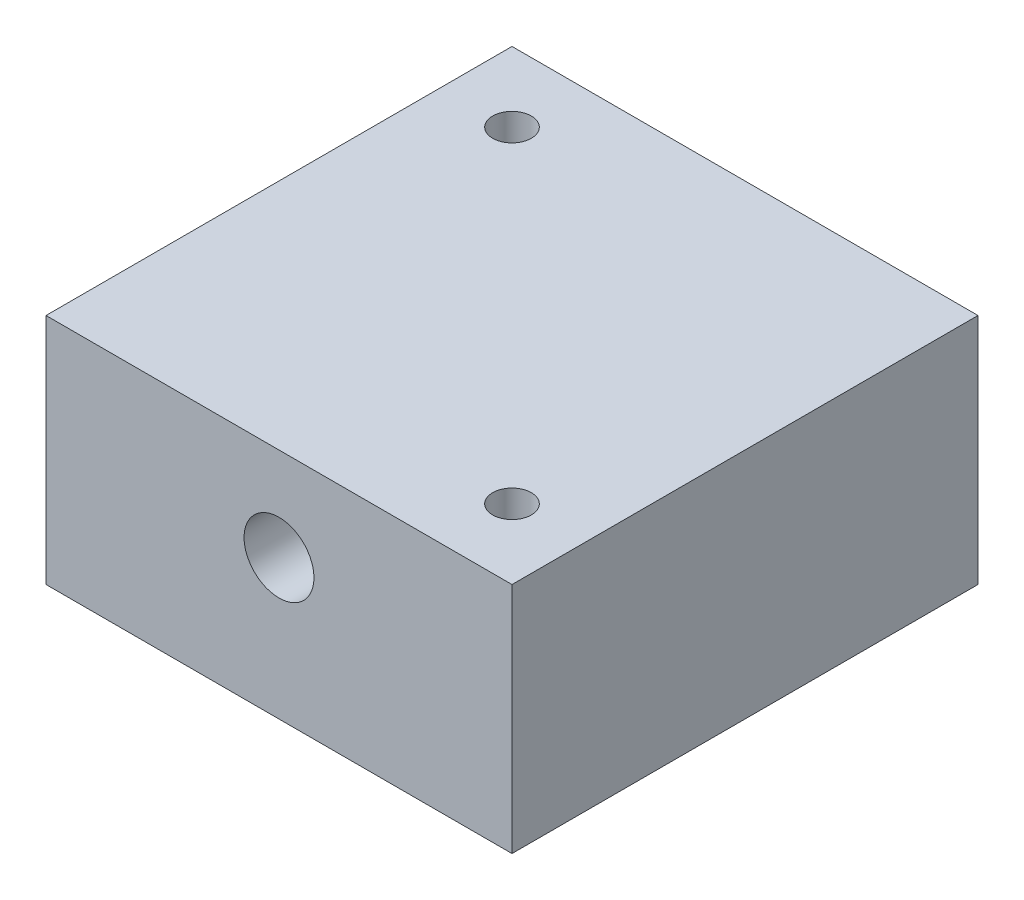
ISO-10303-21;
HEADER;
FILE_DESCRIPTION(('STEP AP214'),'2;1');
FILE_NAME('part.step','',(''),(''),'','','');
FILE_SCHEMA(('AUTOMOTIVE_DESIGN { 1 0 10303 214 1 1 1 1 }'));
ENDSEC;
DATA;
#1=APPLICATION_CONTEXT('core data for automotive mechanical design processes');
#2=APPLICATION_PROTOCOL_DEFINITION('international standard','automotive_design',2000,#1);
#3=PRODUCT_CONTEXT('',#1,'mechanical');
#4=PRODUCT('Part','Part','',(#3));
#5=PRODUCT_RELATED_PRODUCT_CATEGORY('part','',(#4));
#6=PRODUCT_DEFINITION_FORMATION('','',#4);
#7=PRODUCT_DEFINITION_CONTEXT('part definition',#1,'design');
#8=PRODUCT_DEFINITION('design','',#6,#7);
#9=PRODUCT_DEFINITION_SHAPE('','',#8);
#10=(LENGTH_UNIT() NAMED_UNIT(*) SI_UNIT(.MILLI.,.METRE.));
#11=(NAMED_UNIT(*) PLANE_ANGLE_UNIT() SI_UNIT($,.RADIAN.));
#12=(NAMED_UNIT(*) SI_UNIT($,.STERADIAN.) SOLID_ANGLE_UNIT());
#13=UNCERTAINTY_MEASURE_WITH_UNIT(LENGTH_MEASURE(1.E-05),#10,'distance_accuracy_value','');
#14=(GEOMETRIC_REPRESENTATION_CONTEXT(3) GLOBAL_UNCERTAINTY_ASSIGNED_CONTEXT((#13)) GLOBAL_UNIT_ASSIGNED_CONTEXT((#10,
#11,#12)) REPRESENTATION_CONTEXT('',''));
#15=CARTESIAN_POINT('',(0.,0.,0.));
#16=DIRECTION('',(0.,0.,1.));
#17=DIRECTION('',(1.,0.,0.));
#18=AXIS2_PLACEMENT_3D('',#15,#16,#17);
#19=CARTESIAN_POINT('',(0.,0.,0.));
#20=DIRECTION('',(0.,0.,1.));
#21=DIRECTION('',(1.,0.,0.));
#22=AXIS2_PLACEMENT_3D('',#19,#20,#21);
#23=PLANE('',#22);
#24=CARTESIAN_POINT('',(-19.2307692307697,5.76922632478635,0.));
#25=DIRECTION('',(0.,0.,-1.));
#26=DIRECTION('',(-1.,0.,0.));
#27=AXIS2_PLACEMENT_3D('',#24,#25,#26);
#28=CIRCLE('',#27,4.14999999999999);
#29=CARTESIAN_POINT('',(-23.3807692307697,5.76922632478635,0.));
#30=VERTEX_POINT('',#29);
#31=EDGE_CURVE('E103',#30,#30,#28,.T.);
#32=ORIENTED_EDGE('',*,*,#31,.F.);
#33=EDGE_LOOP('',(#32));
#34=FACE_BOUND('',#33,.T.);
#35=CARTESIAN_POINT('',(4.44444443054026E-06,5.00000000000007,0.));
#36=DIRECTION('',(0.,0.,1.));
#37=DIRECTION('',(1.,0.,0.));
#38=AXIS2_PLACEMENT_3D('',#35,#36,#37);
#39=CIRCLE('',#38,7.49999999999999);
#40=CARTESIAN_POINT('',(7.50000444444442,5.00000000000007,0.));
#41=VERTEX_POINT('',#40);
#42=EDGE_CURVE('E37',#41,#41,#39,.T.);
#43=ORIENTED_EDGE('',*,*,#42,.T.);
#44=EDGE_LOOP('',(#43));
#45=FACE_BOUND('',#44,.T.);
#46=DIRECTION('',(0.,-1.,0.));
#47=VECTOR('',#46,1.);
#48=CARTESIAN_POINT('',(-50.,-25.,0.));
#49=LINE('',#48,#47);
#50=CARTESIAN_POINT('',(-50.,25.,0.));
#51=VERTEX_POINT('',#50);
#52=CARTESIAN_POINT('',(-50.,-25.,0.));
#53=VERTEX_POINT('',#52);
#54=EDGE_CURVE('E122',#51,#53,#49,.T.);
#55=ORIENTED_EDGE('',*,*,#54,.F.);
#56=DIRECTION('',(-1.,0.,0.));
#57=VECTOR('',#56,1.);
#58=CARTESIAN_POINT('',(50.,25.,0.));
#59=LINE('',#58,#57);
#60=CARTESIAN_POINT('',(50.,25.,0.));
#61=VERTEX_POINT('',#60);
#62=EDGE_CURVE('E75',#61,#51,#59,.T.);
#63=ORIENTED_EDGE('',*,*,#62,.F.);
#64=DIRECTION('',(0.,1.,0.));
#65=VECTOR('',#64,1.);
#66=CARTESIAN_POINT('',(50.,-25.,0.));
#67=LINE('',#66,#65);
#68=CARTESIAN_POINT('',(50.,-25.,0.));
#69=VERTEX_POINT('',#68);
#70=EDGE_CURVE('E69',#69,#61,#67,.T.);
#71=ORIENTED_EDGE('',*,*,#70,.F.);
#72=DIRECTION('',(1.,0.,0.));
#73=VECTOR('',#72,1.);
#74=CARTESIAN_POINT('',(50.,-25.,0.));
#75=LINE('',#74,#73);
#76=EDGE_CURVE('E132',#53,#69,#75,.T.);
#77=ORIENTED_EDGE('',*,*,#76,.F.);
#78=EDGE_LOOP('',(#55,#63,#71,#77));
#79=FACE_BOUND('',#78,.T.);
#80=ADVANCED_FACE('F33',(#34,#45,#79),#23,.F.);
#81=CARTESIAN_POINT('',(-50.,-25.,100.));
#82=DIRECTION('',(1.,0.,0.));
#83=DIRECTION('',(0.,1.,0.));
#84=AXIS2_PLACEMENT_3D('',#81,#82,#83);
#85=PLANE('',#84);
#86=ORIENTED_EDGE('',*,*,#54,.T.);
#87=DIRECTION('',(0.,0.,-1.));
#88=VECTOR('',#87,1.);
#89=CARTESIAN_POINT('',(-50.,-25.,100.));
#90=LINE('',#89,#88);
#91=CARTESIAN_POINT('',(-50.,-25.,100.));
#92=VERTEX_POINT('',#91);
#93=EDGE_CURVE('E11',#92,#53,#90,.T.);
#94=ORIENTED_EDGE('',*,*,#93,.F.);
#95=DIRECTION('',(0.,-1.,0.));
#96=VECTOR('',#95,1.);
#97=CARTESIAN_POINT('',(-50.,-25.,100.));
#98=LINE('',#97,#96);
#99=CARTESIAN_POINT('',(-50.,25.,100.));
#100=VERTEX_POINT('',#99);
#101=EDGE_CURVE('E123',#100,#92,#98,.T.);
#102=ORIENTED_EDGE('',*,*,#101,.F.);
#103=DIRECTION('',(0.,0.,-1.));
#104=VECTOR('',#103,1.);
#105=CARTESIAN_POINT('',(-50.,25.,100.));
#106=LINE('',#105,#104);
#107=EDGE_CURVE('E129',#100,#51,#106,.T.);
#108=ORIENTED_EDGE('',*,*,#107,.T.);
#109=EDGE_LOOP('',(#86,#94,#102,#108));
#110=FACE_BOUND('',#109,.T.);
#111=ADVANCED_FACE('F35',(#110),#85,.F.);
#112=CARTESIAN_POINT('',(50.,-25.,100.));
#113=DIRECTION('',(0.,1.,0.));
#114=DIRECTION('',(-1.,0.,0.));
#115=AXIS2_PLACEMENT_3D('',#112,#113,#114);
#116=PLANE('',#115);
#117=ORIENTED_EDGE('',*,*,#76,.T.);
#118=DIRECTION('',(0.,0.,-1.));
#119=VECTOR('',#118,1.);
#120=CARTESIAN_POINT('',(50.,-25.,100.));
#121=LINE('',#120,#119);
#122=CARTESIAN_POINT('',(50.,-25.,100.));
#123=VERTEX_POINT('',#122);
#124=EDGE_CURVE('E43',#123,#69,#121,.T.);
#125=ORIENTED_EDGE('',*,*,#124,.F.);
#126=DIRECTION('',(1.,0.,0.));
#127=VECTOR('',#126,1.);
#128=CARTESIAN_POINT('',(50.,-25.,100.));
#129=LINE('',#128,#127);
#130=EDGE_CURVE('E82',#92,#123,#129,.T.);
#131=ORIENTED_EDGE('',*,*,#130,.F.);
#132=ORIENTED_EDGE('',*,*,#93,.T.);
#133=EDGE_LOOP('',(#117,#125,#131,#132));
#134=FACE_BOUND('',#133,.T.);
#135=ADVANCED_FACE('F158',(#134),#116,.F.);
#136=CARTESIAN_POINT('',(50.,-25.,100.));
#137=DIRECTION('',(-1.,0.,0.));
#138=DIRECTION('',(0.,-1.,0.));
#139=AXIS2_PLACEMENT_3D('',#136,#137,#138);
#140=PLANE('',#139);
#141=ORIENTED_EDGE('',*,*,#70,.T.);
#142=DIRECTION('',(0.,0.,-1.));
#143=VECTOR('',#142,1.);
#144=CARTESIAN_POINT('',(50.,25.,100.));
#145=LINE('',#144,#143);
#146=CARTESIAN_POINT('',(50.,25.,100.));
#147=VERTEX_POINT('',#146);
#148=EDGE_CURVE('E137',#147,#61,#145,.T.);
#149=ORIENTED_EDGE('',*,*,#148,.F.);
#150=DIRECTION('',(0.,1.,0.));
#151=VECTOR('',#150,1.);
#152=CARTESIAN_POINT('',(50.,-25.,100.));
#153=LINE('',#152,#151);
#154=EDGE_CURVE('E126',#123,#147,#153,.T.);
#155=ORIENTED_EDGE('',*,*,#154,.F.);
#156=ORIENTED_EDGE('',*,*,#124,.T.);
#157=EDGE_LOOP('',(#141,#149,#155,#156));
#158=FACE_BOUND('',#157,.T.);
#159=ADVANCED_FACE('F140',(#158),#140,.F.);
#160=CARTESIAN_POINT('',(50.,25.,100.));
#161=DIRECTION('',(0.,-1.,0.));
#162=DIRECTION('',(1.,0.,0.));
#163=AXIS2_PLACEMENT_3D('',#160,#161,#162);
#164=PLANE('',#163);
#165=CARTESIAN_POINT('',(35.,25.,85.));
#166=DIRECTION('',(0.,1.,0.));
#167=DIRECTION('',(0.,0.,1.));
#168=AXIS2_PLACEMENT_3D('',#165,#166,#167);
#169=CIRCLE('',#168,4.14999999999999);
#170=CARTESIAN_POINT('',(35.,25.,89.15));
#171=VERTEX_POINT('',#170);
#172=EDGE_CURVE('E110',#171,#171,#169,.T.);
#173=ORIENTED_EDGE('',*,*,#172,.F.);
#174=EDGE_LOOP('',(#173));
#175=FACE_BOUND('',#174,.T.);
#176=CARTESIAN_POINT('',(-35.,25.,15.));
#177=DIRECTION('',(0.,1.,0.));
#178=DIRECTION('',(0.,0.,1.));
#179=AXIS2_PLACEMENT_3D('',#176,#177,#178);
#180=CIRCLE('',#179,4.14999999999999);
#181=CARTESIAN_POINT('',(-35.,25.,19.15));
#182=VERTEX_POINT('',#181);
#183=EDGE_CURVE('E116',#182,#182,#180,.T.);
#184=ORIENTED_EDGE('',*,*,#183,.F.);
#185=EDGE_LOOP('',(#184));
#186=FACE_BOUND('',#185,.T.);
#187=ORIENTED_EDGE('',*,*,#62,.T.);
#188=ORIENTED_EDGE('',*,*,#107,.F.);
#189=DIRECTION('',(-1.,0.,0.));
#190=VECTOR('',#189,1.);
#191=CARTESIAN_POINT('',(50.,25.,100.));
#192=LINE('',#191,#190);
#193=EDGE_CURVE('E51',#147,#100,#192,.T.);
#194=ORIENTED_EDGE('',*,*,#193,.F.);
#195=ORIENTED_EDGE('',*,*,#148,.T.);
#196=EDGE_LOOP('',(#187,#188,#194,#195));
#197=FACE_BOUND('',#196,.T.);
#198=ADVANCED_FACE('F146',(#175,#186,#197),#164,.F.);
#199=CARTESIAN_POINT('',(0.,0.,100.));
#200=DIRECTION('',(0.,0.,1.));
#201=DIRECTION('',(1.,0.,0.));
#202=AXIS2_PLACEMENT_3D('',#199,#200,#201);
#203=PLANE('',#202);
#204=CARTESIAN_POINT('',(4.44444443054026E-06,5.00000000000007,100.));
#205=DIRECTION('',(0.,0.,1.));
#206=DIRECTION('',(1.,0.,0.));
#207=AXIS2_PLACEMENT_3D('',#204,#205,#206);
#208=CIRCLE('',#207,7.5);
#209=CARTESIAN_POINT('',(7.50000444444443,5.00000000000007,100.));
#210=VERTEX_POINT('',#209);
#211=EDGE_CURVE('E102',#210,#210,#208,.T.);
#212=ORIENTED_EDGE('',*,*,#211,.F.);
#213=EDGE_LOOP('',(#212));
#214=FACE_BOUND('',#213,.T.);
#215=ORIENTED_EDGE('',*,*,#101,.T.);
#216=ORIENTED_EDGE('',*,*,#130,.T.);
#217=ORIENTED_EDGE('',*,*,#154,.T.);
#218=ORIENTED_EDGE('',*,*,#193,.T.);
#219=EDGE_LOOP('',(#215,#216,#217,#218));
#220=FACE_BOUND('',#219,.T.);
#221=ADVANCED_FACE('F148',(#214,#220),#203,.T.);
#222=CARTESIAN_POINT('',(-35.,5.,15.));
#223=DIRECTION('',(0.,1.,0.));
#224=DIRECTION('',(0.,0.,1.));
#225=AXIS2_PLACEMENT_3D('',#222,#223,#224);
#226=CONICAL_SURFACE('',#225,4.14999999999999,1.02974425867665);
#227=CARTESIAN_POINT('',(-35.,2.50642843103562,15.));
#228=VERTEX_POINT('',#227);
#229=VERTEX_LOOP('',#228);
#230=FACE_BOUND('',#229,.T.);
#231=CARTESIAN_POINT('',(-35.,5.,15.));
#232=DIRECTION('',(0.,1.,0.));
#233=DIRECTION('',(0.,0.,1.));
#234=AXIS2_PLACEMENT_3D('',#231,#232,#233);
#235=CIRCLE('',#234,4.14999999999999);
#236=CARTESIAN_POINT('',(-35.,5.,19.15));
#237=VERTEX_POINT('',#236);
#238=EDGE_CURVE('E119',#237,#237,#235,.T.);
#239=ORIENTED_EDGE('',*,*,#238,.T.);
#240=EDGE_LOOP('',(#239));
#241=FACE_BOUND('',#240,.T.);
#242=ADVANCED_FACE('F155',(#230,#241),#226,.F.);
#243=CARTESIAN_POINT('',(-35.,25.,15.));
#244=DIRECTION('',(0.,1.,0.));
#245=DIRECTION('',(0.,0.,1.));
#246=AXIS2_PLACEMENT_3D('',#243,#244,#245);
#247=CYLINDRICAL_SURFACE('',#246,4.14999999999999);
#248=ORIENTED_EDGE('',*,*,#238,.F.);
#249=EDGE_LOOP('',(#248));
#250=FACE_BOUND('',#249,.T.);
#251=ORIENTED_EDGE('',*,*,#183,.T.);
#252=EDGE_LOOP('',(#251));
#253=FACE_BOUND('',#252,.T.);
#254=ADVANCED_FACE('F175',(#250,#253),#247,.F.);
#255=CARTESIAN_POINT('',(35.,5.,85.));
#256=DIRECTION('',(0.,1.,0.));
#257=DIRECTION('',(0.,0.,1.));
#258=AXIS2_PLACEMENT_3D('',#255,#256,#257);
#259=CONICAL_SURFACE('',#258,4.14999999999999,1.02974425867665);
#260=CARTESIAN_POINT('',(35.,2.50642843103562,85.));
#261=VERTEX_POINT('',#260);
#262=VERTEX_LOOP('',#261);
#263=FACE_BOUND('',#262,.T.);
#264=CARTESIAN_POINT('',(35.,5.,85.));
#265=DIRECTION('',(0.,1.,0.));
#266=DIRECTION('',(0.,0.,1.));
#267=AXIS2_PLACEMENT_3D('',#264,#265,#266);
#268=CIRCLE('',#267,4.14999999999999);
#269=CARTESIAN_POINT('',(35.,5.,89.15));
#270=VERTEX_POINT('',#269);
#271=EDGE_CURVE('E113',#270,#270,#268,.T.);
#272=ORIENTED_EDGE('',*,*,#271,.T.);
#273=EDGE_LOOP('',(#272));
#274=FACE_BOUND('',#273,.T.);
#275=ADVANCED_FACE('F179',(#263,#274),#259,.F.);
#276=CARTESIAN_POINT('',(35.,25.,85.));
#277=DIRECTION('',(0.,1.,0.));
#278=DIRECTION('',(0.,0.,1.));
#279=AXIS2_PLACEMENT_3D('',#276,#277,#278);
#280=CYLINDRICAL_SURFACE('',#279,4.14999999999999);
#281=ORIENTED_EDGE('',*,*,#271,.F.);
#282=EDGE_LOOP('',(#281));
#283=FACE_BOUND('',#282,.T.);
#284=ORIENTED_EDGE('',*,*,#172,.T.);
#285=EDGE_LOOP('',(#284));
#286=FACE_BOUND('',#285,.T.);
#287=ADVANCED_FACE('F183',(#283,#286),#280,.F.);
#288=CARTESIAN_POINT('',(4.44444443054026E-06,5.00000000000007,100.));
#289=DIRECTION('',(0.,0.,1.));
#290=DIRECTION('',(1.,0.,0.));
#291=AXIS2_PLACEMENT_3D('',#288,#289,#290);
#292=CYLINDRICAL_SURFACE('',#291,7.49999999999999);
#293=ORIENTED_EDGE('',*,*,#211,.T.);
#294=EDGE_LOOP('',(#293));
#295=FACE_BOUND('',#294,.T.);
#296=ORIENTED_EDGE('',*,*,#42,.F.);
#297=EDGE_LOOP('',(#296));
#298=FACE_BOUND('',#297,.T.);
#299=ADVANCED_FACE('F96',(#295,#298),#292,.F.);
#300=CARTESIAN_POINT('',(-19.2307692307697,5.76922632478635,20.));
#301=DIRECTION('',(0.,0.,-1.));
#302=DIRECTION('',(-1.,0.,0.));
#303=AXIS2_PLACEMENT_3D('',#300,#301,#302);
#304=CONICAL_SURFACE('',#303,4.14999999999999,1.02974425867665);
#305=CARTESIAN_POINT('',(-19.2307692307697,5.76922632478635,22.4935715689644));
#306=VERTEX_POINT('',#305);
#307=VERTEX_LOOP('',#306);
#308=FACE_BOUND('',#307,.T.);
#309=CARTESIAN_POINT('',(-19.2307692307697,5.76922632478635,20.));
#310=DIRECTION('',(0.,0.,-1.));
#311=DIRECTION('',(-1.,0.,0.));
#312=AXIS2_PLACEMENT_3D('',#309,#310,#311);
#313=CIRCLE('',#312,4.14999999999999);
#314=CARTESIAN_POINT('',(-23.3807692307697,5.76922632478635,20.));
#315=VERTEX_POINT('',#314);
#316=EDGE_CURVE('E100',#315,#315,#313,.T.);
#317=ORIENTED_EDGE('',*,*,#316,.T.);
#318=EDGE_LOOP('',(#317));
#319=FACE_BOUND('',#318,.T.);
#320=ADVANCED_FACE('F92',(#308,#319),#304,.F.);
#321=CARTESIAN_POINT('',(-19.2307692307697,5.76922632478635,0.));
#322=DIRECTION('',(0.,0.,-1.));
#323=DIRECTION('',(-1.,0.,0.));
#324=AXIS2_PLACEMENT_3D('',#321,#322,#323);
#325=CYLINDRICAL_SURFACE('',#324,4.14999999999999);
#326=ORIENTED_EDGE('',*,*,#316,.F.);
#327=EDGE_LOOP('',(#326));
#328=FACE_BOUND('',#327,.T.);
#329=ORIENTED_EDGE('',*,*,#31,.T.);
#330=EDGE_LOOP('',(#329));
#331=FACE_BOUND('',#330,.T.);
#332=ADVANCED_FACE('F95',(#328,#331),#325,.F.);
#333=CLOSED_SHELL('',(#80,#111,#135,#159,#198,#221,#242,#254,#275,#287,#299,#320,#332));
#334=MANIFOLD_SOLID_BREP('B2',#333);
#335=ADVANCED_BREP_SHAPE_REPRESENTATION('',(#18,#334),#14);
#336=SHAPE_DEFINITION_REPRESENTATION(#9,#335);
ENDSEC;
END-ISO-10303-21;
